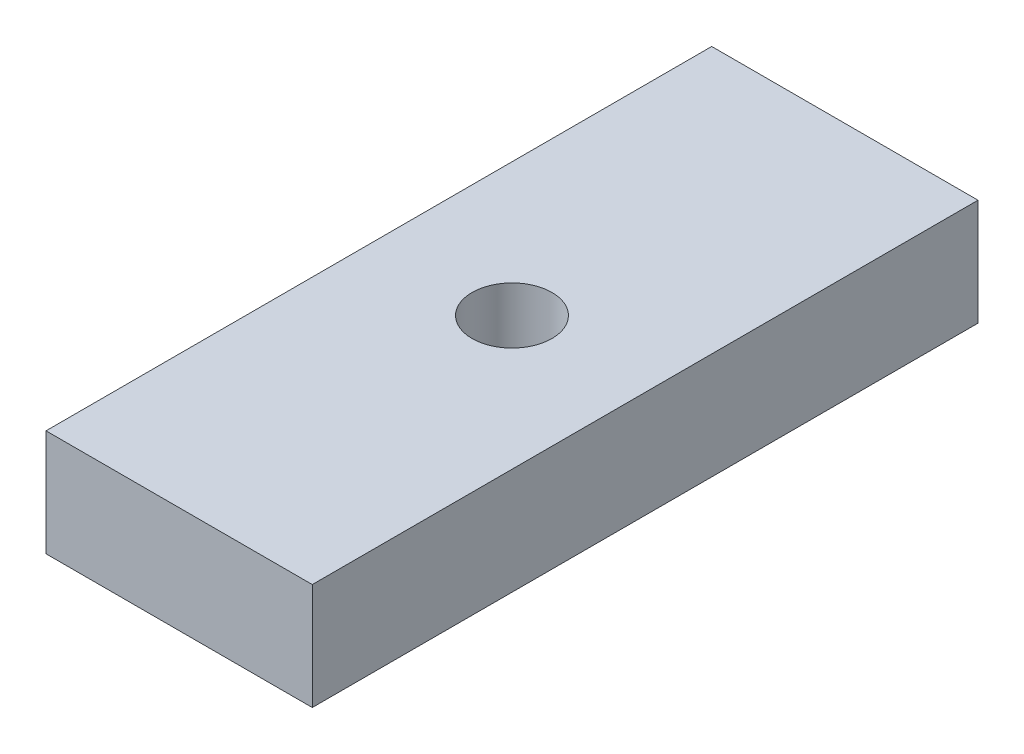
ISO-10303-21;
HEADER;
FILE_DESCRIPTION(('STEP AP214'),'2;1');
FILE_NAME('part.step','',(''),(''),'','','');
FILE_SCHEMA(('AUTOMOTIVE_DESIGN { 1 0 10303 214 1 1 1 1 }'));
ENDSEC;
DATA;
#1=APPLICATION_CONTEXT('core data for automotive mechanical design processes');
#2=APPLICATION_PROTOCOL_DEFINITION('international standard','automotive_design',2000,#1);
#3=PRODUCT_CONTEXT('',#1,'mechanical');
#4=PRODUCT('Part','Part','',(#3));
#5=PRODUCT_RELATED_PRODUCT_CATEGORY('part','',(#4));
#6=PRODUCT_DEFINITION_FORMATION('','',#4);
#7=PRODUCT_DEFINITION_CONTEXT('part definition',#1,'design');
#8=PRODUCT_DEFINITION('design','',#6,#7);
#9=PRODUCT_DEFINITION_SHAPE('','',#8);
#10=(LENGTH_UNIT() NAMED_UNIT(*) SI_UNIT(.MILLI.,.METRE.));
#11=(NAMED_UNIT(*) PLANE_ANGLE_UNIT() SI_UNIT($,.RADIAN.));
#12=(NAMED_UNIT(*) SI_UNIT($,.STERADIAN.) SOLID_ANGLE_UNIT());
#13=UNCERTAINTY_MEASURE_WITH_UNIT(LENGTH_MEASURE(1.E-05),#10,'distance_accuracy_value','');
#14=(GEOMETRIC_REPRESENTATION_CONTEXT(3) GLOBAL_UNCERTAINTY_ASSIGNED_CONTEXT((#13)) GLOBAL_UNIT_ASSIGNED_CONTEXT((#10,
#11,#12)) REPRESENTATION_CONTEXT('',''));
#15=CARTESIAN_POINT('',(0.,0.,0.));
#16=DIRECTION('',(0.,0.,1.));
#17=DIRECTION('',(1.,0.,0.));
#18=AXIS2_PLACEMENT_3D('',#15,#16,#17);
#19=CARTESIAN_POINT('',(10.,4.,0.));
#20=DIRECTION('',(0.,0.,-1.));
#21=DIRECTION('',(0.,1.,0.));
#22=AXIS2_PLACEMENT_3D('',#19,#20,#21);
#23=PLANE('',#22);
#24=DIRECTION('',(0.,-1.,0.));
#25=VECTOR('',#24,1.);
#26=CARTESIAN_POINT('',(0.,4.,0.));
#27=LINE('',#26,#25);
#28=CARTESIAN_POINT('',(0.,4.,0.));
#29=VERTEX_POINT('',#28);
#30=CARTESIAN_POINT('',(0.,0.,0.));
#31=VERTEX_POINT('',#30);
#32=EDGE_CURVE('E102',#29,#31,#27,.T.);
#33=ORIENTED_EDGE('',*,*,#32,.T.);
#34=DIRECTION('',(-1.,0.,0.));
#35=VECTOR('',#34,1.);
#36=CARTESIAN_POINT('',(10.,0.,0.));
#37=LINE('',#36,#35);
#38=CARTESIAN_POINT('',(10.,0.,0.));
#39=VERTEX_POINT('',#38);
#40=EDGE_CURVE('E11',#39,#31,#37,.T.);
#41=ORIENTED_EDGE('',*,*,#40,.F.);
#42=DIRECTION('',(0.,-1.,0.));
#43=VECTOR('',#42,1.);
#44=CARTESIAN_POINT('',(10.,4.,0.));
#45=LINE('',#44,#43);
#46=CARTESIAN_POINT('',(10.,4.,0.));
#47=VERTEX_POINT('',#46);
#48=EDGE_CURVE('E90',#47,#39,#45,.T.);
#49=ORIENTED_EDGE('',*,*,#48,.F.);
#50=DIRECTION('',(-1.,0.,0.));
#51=VECTOR('',#50,1.);
#52=CARTESIAN_POINT('',(10.,4.,0.));
#53=LINE('',#52,#51);
#54=EDGE_CURVE('E98',#47,#29,#53,.T.);
#55=ORIENTED_EDGE('',*,*,#54,.T.);
#56=EDGE_LOOP('',(#33,#41,#49,#55));
#57=FACE_BOUND('',#56,.T.);
#58=ADVANCED_FACE('F39',(#57),#23,.F.);
#59=CARTESIAN_POINT('',(10.,0.,0.));
#60=DIRECTION('',(0.,1.,0.));
#61=DIRECTION('',(0.,0.,1.));
#62=AXIS2_PLACEMENT_3D('',#59,#60,#61);
#63=PLANE('',#62);
#64=CARTESIAN_POINT('',(5.,0.,-12.5));
#65=DIRECTION('',(0.,1.,0.));
#66=DIRECTION('',(0.,0.,1.));
#67=AXIS2_PLACEMENT_3D('',#64,#65,#66);
#68=CIRCLE('',#67,1.5);
#69=CARTESIAN_POINT('',(5.,0.,-11.));
#70=VERTEX_POINT('',#69);
#71=EDGE_CURVE('E105',#70,#70,#68,.T.);
#72=ORIENTED_EDGE('',*,*,#71,.T.);
#73=EDGE_LOOP('',(#72));
#74=FACE_BOUND('',#73,.T.);
#75=DIRECTION('',(0.,0.,-1.));
#76=VECTOR('',#75,1.);
#77=CARTESIAN_POINT('',(0.,0.,0.));
#78=LINE('',#77,#76);
#79=CARTESIAN_POINT('',(0.,0.,-25.));
#80=VERTEX_POINT('',#79);
#81=EDGE_CURVE('E94',#31,#80,#78,.T.);
#82=ORIENTED_EDGE('',*,*,#81,.T.);
#83=DIRECTION('',(-1.,0.,0.));
#84=VECTOR('',#83,1.);
#85=CARTESIAN_POINT('',(10.,0.,-25.));
#86=LINE('',#85,#84);
#87=CARTESIAN_POINT('',(10.,0.,-25.));
#88=VERTEX_POINT('',#87);
#89=EDGE_CURVE('E47',#88,#80,#86,.T.);
#90=ORIENTED_EDGE('',*,*,#89,.F.);
#91=DIRECTION('',(0.,0.,-1.));
#92=VECTOR('',#91,1.);
#93=CARTESIAN_POINT('',(10.,0.,0.));
#94=LINE('',#93,#92);
#95=EDGE_CURVE('E85',#39,#88,#94,.T.);
#96=ORIENTED_EDGE('',*,*,#95,.F.);
#97=ORIENTED_EDGE('',*,*,#40,.T.);
#98=EDGE_LOOP('',(#82,#90,#96,#97));
#99=FACE_BOUND('',#98,.T.);
#100=ADVANCED_FACE('F93',(#74,#99),#63,.F.);
#101=CARTESIAN_POINT('',(10.,0.,-25.));
#102=DIRECTION('',(0.,0.,1.));
#103=DIRECTION('',(1.,0.,0.));
#104=AXIS2_PLACEMENT_3D('',#101,#102,#103);
#105=PLANE('',#104);
#106=DIRECTION('',(0.,1.,0.));
#107=VECTOR('',#106,1.);
#108=CARTESIAN_POINT('',(0.,0.,-25.));
#109=LINE('',#108,#107);
#110=CARTESIAN_POINT('',(0.,4.,-25.));
#111=VERTEX_POINT('',#110);
#112=EDGE_CURVE('E72',#80,#111,#109,.T.);
#113=ORIENTED_EDGE('',*,*,#112,.T.);
#114=DIRECTION('',(-1.,0.,0.));
#115=VECTOR('',#114,1.);
#116=CARTESIAN_POINT('',(10.,4.,-25.));
#117=LINE('',#116,#115);
#118=CARTESIAN_POINT('',(10.,4.,-25.));
#119=VERTEX_POINT('',#118);
#120=EDGE_CURVE('E95',#119,#111,#117,.T.);
#121=ORIENTED_EDGE('',*,*,#120,.F.);
#122=DIRECTION('',(0.,1.,0.));
#123=VECTOR('',#122,1.);
#124=CARTESIAN_POINT('',(10.,0.,-25.));
#125=LINE('',#124,#123);
#126=EDGE_CURVE('E88',#88,#119,#125,.T.);
#127=ORIENTED_EDGE('',*,*,#126,.F.);
#128=ORIENTED_EDGE('',*,*,#89,.T.);
#129=EDGE_LOOP('',(#113,#121,#127,#128));
#130=FACE_BOUND('',#129,.T.);
#131=ADVANCED_FACE('F96',(#130),#105,.F.);
#132=CARTESIAN_POINT('',(10.,4.,-25.));
#133=DIRECTION('',(0.,-1.,0.));
#134=DIRECTION('',(0.,0.,-1.));
#135=AXIS2_PLACEMENT_3D('',#132,#133,#134);
#136=PLANE('',#135);
#137=CARTESIAN_POINT('',(5.,4.,-12.5));
#138=DIRECTION('',(0.,1.,0.));
#139=DIRECTION('',(0.,0.,1.));
#140=AXIS2_PLACEMENT_3D('',#137,#138,#139);
#141=CIRCLE('',#140,1.5);
#142=CARTESIAN_POINT('',(5.,4.,-11.));
#143=VERTEX_POINT('',#142);
#144=EDGE_CURVE('E116',#143,#143,#141,.T.);
#145=ORIENTED_EDGE('',*,*,#144,.F.);
#146=EDGE_LOOP('',(#145));
#147=FACE_BOUND('',#146,.T.);
#148=DIRECTION('',(0.,0.,1.));
#149=VECTOR('',#148,1.);
#150=CARTESIAN_POINT('',(0.,4.,-25.));
#151=LINE('',#150,#149);
#152=EDGE_CURVE('E78',#111,#29,#151,.T.);
#153=ORIENTED_EDGE('',*,*,#152,.T.);
#154=ORIENTED_EDGE('',*,*,#54,.F.);
#155=DIRECTION('',(0.,0.,1.));
#156=VECTOR('',#155,1.);
#157=CARTESIAN_POINT('',(10.,4.,-25.));
#158=LINE('',#157,#156);
#159=EDGE_CURVE('E55',#119,#47,#158,.T.);
#160=ORIENTED_EDGE('',*,*,#159,.F.);
#161=ORIENTED_EDGE('',*,*,#120,.T.);
#162=EDGE_LOOP('',(#153,#154,#160,#161));
#163=FACE_BOUND('',#162,.T.);
#164=ADVANCED_FACE('F110',(#147,#163),#136,.F.);
#165=CARTESIAN_POINT('',(10.,0.,0.));
#166=DIRECTION('',(1.,0.,0.));
#167=DIRECTION('',(0.,0.,-1.));
#168=AXIS2_PLACEMENT_3D('',#165,#166,#167);
#169=PLANE('',#168);
#170=ORIENTED_EDGE('',*,*,#48,.T.);
#171=ORIENTED_EDGE('',*,*,#95,.T.);
#172=ORIENTED_EDGE('',*,*,#126,.T.);
#173=ORIENTED_EDGE('',*,*,#159,.T.);
#174=EDGE_LOOP('',(#170,#171,#172,#173));
#175=FACE_BOUND('',#174,.T.);
#176=ADVANCED_FACE('F86',(#175),#169,.T.);
#177=CARTESIAN_POINT('',(0.,0.,0.));
#178=DIRECTION('',(1.,0.,0.));
#179=DIRECTION('',(0.,0.,-1.));
#180=AXIS2_PLACEMENT_3D('',#177,#178,#179);
#181=PLANE('',#180);
#182=ORIENTED_EDGE('',*,*,#32,.F.);
#183=ORIENTED_EDGE('',*,*,#152,.F.);
#184=ORIENTED_EDGE('',*,*,#112,.F.);
#185=ORIENTED_EDGE('',*,*,#81,.F.);
#186=EDGE_LOOP('',(#182,#183,#184,#185));
#187=FACE_BOUND('',#186,.T.);
#188=ADVANCED_FACE('F113',(#187),#181,.F.);
#189=CARTESIAN_POINT('',(5.,0.,-12.5));
#190=DIRECTION('',(0.,1.,0.));
#191=DIRECTION('',(0.,0.,1.));
#192=AXIS2_PLACEMENT_3D('',#189,#190,#191);
#193=CYLINDRICAL_SURFACE('',#192,1.5);
#194=ORIENTED_EDGE('',*,*,#71,.F.);
#195=EDGE_LOOP('',(#194));
#196=FACE_BOUND('',#195,.T.);
#197=ORIENTED_EDGE('',*,*,#144,.T.);
#198=EDGE_LOOP('',(#197));
#199=FACE_BOUND('',#198,.T.);
#200=ADVANCED_FACE('F123',(#196,#199),#193,.F.);
#201=CLOSED_SHELL('',(#58,#100,#131,#164,#176,#188,#200));
#202=MANIFOLD_SOLID_BREP('B2',#201);
#203=ADVANCED_BREP_SHAPE_REPRESENTATION('',(#18,#202),#14);
#204=SHAPE_DEFINITION_REPRESENTATION(#9,#203);
ENDSEC;
END-ISO-10303-21;
